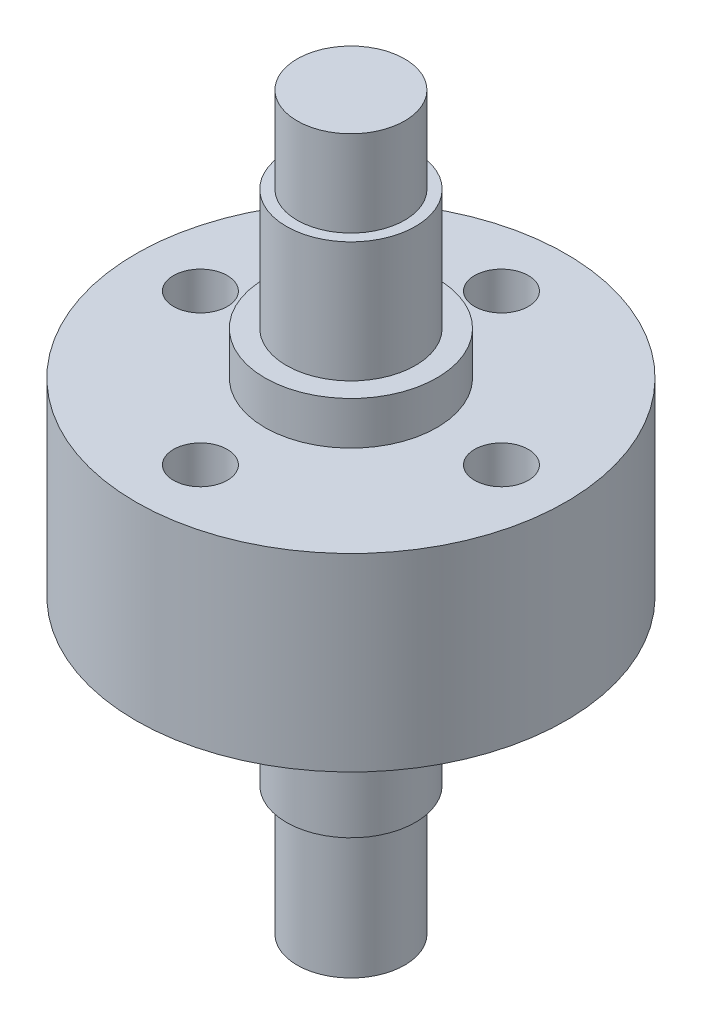
ISO-10303-21;
HEADER;
FILE_DESCRIPTION(('STEP AP214'),'2;1');
FILE_NAME('part.step','',(''),(''),'','','');
FILE_SCHEMA(('AUTOMOTIVE_DESIGN { 1 0 10303 214 1 1 1 1 }'));
ENDSEC;
DATA;
#1=APPLICATION_CONTEXT('core data for automotive mechanical design processes');
#2=APPLICATION_PROTOCOL_DEFINITION('international standard','automotive_design',2000,#1);
#3=PRODUCT_CONTEXT('',#1,'mechanical');
#4=PRODUCT('Part','Part','',(#3));
#5=PRODUCT_RELATED_PRODUCT_CATEGORY('part','',(#4));
#6=PRODUCT_DEFINITION_FORMATION('','',#4);
#7=PRODUCT_DEFINITION_CONTEXT('part definition',#1,'design');
#8=PRODUCT_DEFINITION('design','',#6,#7);
#9=PRODUCT_DEFINITION_SHAPE('','',#8);
#10=(LENGTH_UNIT() NAMED_UNIT(*) SI_UNIT(.MILLI.,.METRE.));
#11=(NAMED_UNIT(*) PLANE_ANGLE_UNIT() SI_UNIT($,.RADIAN.));
#12=(NAMED_UNIT(*) SI_UNIT($,.STERADIAN.) SOLID_ANGLE_UNIT());
#13=UNCERTAINTY_MEASURE_WITH_UNIT(LENGTH_MEASURE(1.E-05),#10,'distance_accuracy_value','');
#14=(GEOMETRIC_REPRESENTATION_CONTEXT(3) GLOBAL_UNCERTAINTY_ASSIGNED_CONTEXT((#13)) GLOBAL_UNIT_ASSIGNED_CONTEXT((#10,
#11,#12)) REPRESENTATION_CONTEXT('',''));
#15=CARTESIAN_POINT('',(0.,0.,0.));
#16=DIRECTION('',(0.,0.,1.));
#17=DIRECTION('',(1.,0.,0.));
#18=AXIS2_PLACEMENT_3D('',#15,#16,#17);
#19=CARTESIAN_POINT('',(2.21364849368684,7.97796080297677,0.));
#20=DIRECTION('',(0.,1.,0.));
#21=DIRECTION('',(0.,0.,1.));
#22=AXIS2_PLACEMENT_3D('',#19,#20,#21);
#23=PLANE('',#22);
#24=CARTESIAN_POINT('',(-8.78635150621402,7.97796080297677,0.));
#25=DIRECTION('',(0.,-1.,0.));
#26=DIRECTION('',(0.,0.,-1.));
#27=AXIS2_PLACEMENT_3D('',#24,#25,#26);
#28=CIRCLE('',#27,1.25);
#29=CARTESIAN_POINT('',(-8.78635150621402,7.97796080297677,-1.24999999999993));
#30=VERTEX_POINT('',#29);
#31=EDGE_CURVE('E101',#30,#30,#28,.T.);
#32=ORIENTED_EDGE('',*,*,#31,.F.);
#33=EDGE_LOOP('',(#32));
#34=FACE_BOUND('',#33,.T.);
#35=CARTESIAN_POINT('',(-1.78635150621402,7.97796080297677,-7.));
#36=DIRECTION('',(0.,-1.,0.));
#37=DIRECTION('',(0.,0.,-1.));
#38=AXIS2_PLACEMENT_3D('',#35,#36,#37);
#39=CIRCLE('',#38,1.25);
#40=CARTESIAN_POINT('',(-1.78635150621402,7.97796080297677,-8.25));
#41=VERTEX_POINT('',#40);
#42=EDGE_CURVE('E95',#41,#41,#39,.T.);
#43=ORIENTED_EDGE('',*,*,#42,.F.);
#44=EDGE_LOOP('',(#43));
#45=FACE_BOUND('',#44,.T.);
#46=CARTESIAN_POINT('',(5.21364849378598,7.97796080297677,0.));
#47=DIRECTION('',(0.,-1.,0.));
#48=DIRECTION('',(0.,0.,-1.));
#49=AXIS2_PLACEMENT_3D('',#46,#47,#48);
#50=CIRCLE('',#49,1.25);
#51=CARTESIAN_POINT('',(5.21364849378598,7.97796080297677,-1.25000000000002));
#52=VERTEX_POINT('',#51);
#53=EDGE_CURVE('E92',#52,#52,#50,.T.);
#54=ORIENTED_EDGE('',*,*,#53,.F.);
#55=EDGE_LOOP('',(#54));
#56=FACE_BOUND('',#55,.T.);
#57=CARTESIAN_POINT('',(-1.78635150621402,7.97796080297677,7.));
#58=DIRECTION('',(0.,-1.,0.));
#59=DIRECTION('',(0.,0.,-1.));
#60=AXIS2_PLACEMENT_3D('',#57,#58,#59);
#61=CIRCLE('',#60,1.25);
#62=CARTESIAN_POINT('',(-1.78635150621402,7.97796080297677,5.75));
#63=VERTEX_POINT('',#62);
#64=EDGE_CURVE('E86',#63,#63,#61,.T.);
#65=ORIENTED_EDGE('',*,*,#64,.F.);
#66=EDGE_LOOP('',(#65));
#67=FACE_BOUND('',#66,.T.);
#68=CARTESIAN_POINT('',(-1.78635150621402,7.97796080297677,0.));
#69=DIRECTION('',(0.,1.,0.));
#70=DIRECTION('',(0.,0.,1.));
#71=AXIS2_PLACEMENT_3D('',#68,#69,#70);
#72=CIRCLE('',#71,10.0000000000246);
#73=CARTESIAN_POINT('',(-1.78635150621402,7.97796080297677,10.0000000000246));
#74=VERTEX_POINT('',#73);
#75=EDGE_CURVE('E10',#74,#74,#72,.T.);
#76=ORIENTED_EDGE('',*,*,#75,.F.);
#77=EDGE_LOOP('',(#76));
#78=FACE_BOUND('',#77,.T.);
#79=CARTESIAN_POINT('',(-1.78635150621402,7.97796080297677,0.));
#80=DIRECTION('',(0.,1.,0.));
#81=DIRECTION('',(0.,0.,1.));
#82=AXIS2_PLACEMENT_3D('',#79,#80,#81);
#83=CIRCLE('',#82,3.99999999990087);
#84=CARTESIAN_POINT('',(-1.78635150621402,7.97796080297677,3.99999999990087));
#85=VERTEX_POINT('',#84);
#86=EDGE_CURVE('E80',#85,#85,#83,.T.);
#87=ORIENTED_EDGE('',*,*,#86,.T.);
#88=EDGE_LOOP('',(#87));
#89=FACE_BOUND('',#88,.T.);
#90=ADVANCED_FACE('F34',(#34,#45,#56,#67,#78,#89),#23,.F.);
#91=CARTESIAN_POINT('',(-1.78635150621402,28.3779608029715,0.));
#92=DIRECTION('',(0.,1.,0.));
#93=DIRECTION('',(0.,0.,1.));
#94=AXIS2_PLACEMENT_3D('',#91,#92,#93);
#95=CYLINDRICAL_SURFACE('',#94,10.0000000000246);
#96=CARTESIAN_POINT('',(-1.78635150621402,16.7779608029166,0.));
#97=DIRECTION('',(0.,1.,0.));
#98=DIRECTION('',(0.,0.,1.));
#99=AXIS2_PLACEMENT_3D('',#96,#97,#98);
#100=CIRCLE('',#99,10.0000000000246);
#101=CARTESIAN_POINT('',(-1.78635150621402,16.7779608029166,10.0000000000246));
#102=VERTEX_POINT('',#101);
#103=EDGE_CURVE('E41',#102,#102,#100,.T.);
#104=ORIENTED_EDGE('',*,*,#103,.F.);
#105=EDGE_LOOP('',(#104));
#106=FACE_BOUND('',#105,.T.);
#107=ORIENTED_EDGE('',*,*,#75,.T.);
#108=EDGE_LOOP('',(#107));
#109=FACE_BOUND('',#108,.T.);
#110=ADVANCED_FACE('F110',(#106,#109),#95,.T.);
#111=CARTESIAN_POINT('',(2.2136484937978,16.7779608029166,0.));
#112=DIRECTION('',(0.,-1.,0.));
#113=DIRECTION('',(0.,0.,-1.));
#114=AXIS2_PLACEMENT_3D('',#111,#112,#113);
#115=PLANE('',#114);
#116=CARTESIAN_POINT('',(-8.78635150621402,16.7779608029166,0.));
#117=DIRECTION('',(0.,-1.,0.));
#118=DIRECTION('',(0.,0.,-1.));
#119=AXIS2_PLACEMENT_3D('',#116,#117,#118);
#120=CIRCLE('',#119,1.25);
#121=CARTESIAN_POINT('',(-8.78635150621402,16.7779608029166,-1.24999999999992));
#122=VERTEX_POINT('',#121);
#123=EDGE_CURVE('E98',#122,#122,#120,.T.);
#124=ORIENTED_EDGE('',*,*,#123,.T.);
#125=EDGE_LOOP('',(#124));
#126=FACE_BOUND('',#125,.T.);
#127=CARTESIAN_POINT('',(-1.78635150621402,16.7779608029166,-7.));
#128=DIRECTION('',(0.,-1.,0.));
#129=DIRECTION('',(0.,0.,-1.));
#130=AXIS2_PLACEMENT_3D('',#127,#128,#129);
#131=CIRCLE('',#130,1.25);
#132=CARTESIAN_POINT('',(-1.78635150621402,16.7779608029166,-8.25));
#133=VERTEX_POINT('',#132);
#134=EDGE_CURVE('E37',#133,#133,#131,.T.);
#135=ORIENTED_EDGE('',*,*,#134,.T.);
#136=EDGE_LOOP('',(#135));
#137=FACE_BOUND('',#136,.T.);
#138=CARTESIAN_POINT('',(5.21364849378598,16.7779608029166,0.));
#139=DIRECTION('',(0.,-1.,0.));
#140=DIRECTION('',(0.,0.,-1.));
#141=AXIS2_PLACEMENT_3D('',#138,#139,#140);
#142=CIRCLE('',#141,1.25);
#143=CARTESIAN_POINT('',(5.21364849378598,16.7779608029166,-1.25000000000002));
#144=VERTEX_POINT('',#143);
#145=EDGE_CURVE('E89',#144,#144,#142,.T.);
#146=ORIENTED_EDGE('',*,*,#145,.T.);
#147=EDGE_LOOP('',(#146));
#148=FACE_BOUND('',#147,.T.);
#149=CARTESIAN_POINT('',(-1.78635150621402,16.7779608029166,7.));
#150=DIRECTION('',(0.,-1.,0.));
#151=DIRECTION('',(0.,0.,-1.));
#152=AXIS2_PLACEMENT_3D('',#149,#150,#151);
#153=CIRCLE('',#152,1.25);
#154=CARTESIAN_POINT('',(-1.78635150621402,16.7779608029166,5.75));
#155=VERTEX_POINT('',#154);
#156=EDGE_CURVE('E83',#155,#155,#153,.T.);
#157=ORIENTED_EDGE('',*,*,#156,.T.);
#158=EDGE_LOOP('',(#157));
#159=FACE_BOUND('',#158,.T.);
#160=CARTESIAN_POINT('',(-1.78635150621402,16.7779608029166,0.));
#161=DIRECTION('',(0.,1.,0.));
#162=DIRECTION('',(0.,0.,1.));
#163=AXIS2_PLACEMENT_3D('',#160,#161,#162);
#164=CIRCLE('',#163,4.00000000001183);
#165=CARTESIAN_POINT('',(-1.78635150621402,16.7779608029166,4.00000000001183));
#166=VERTEX_POINT('',#165);
#167=EDGE_CURVE('E45',#166,#166,#164,.T.);
#168=ORIENTED_EDGE('',*,*,#167,.F.);
#169=EDGE_LOOP('',(#168));
#170=FACE_BOUND('',#169,.T.);
#171=ORIENTED_EDGE('',*,*,#103,.T.);
#172=EDGE_LOOP('',(#171));
#173=FACE_BOUND('',#172,.T.);
#174=ADVANCED_FACE('F180',(#126,#137,#148,#159,#170,#173),#115,.F.);
#175=CARTESIAN_POINT('',(-1.78635150621402,28.3779608029715,0.));
#176=DIRECTION('',(0.,1.,0.));
#177=DIRECTION('',(0.,0.,1.));
#178=AXIS2_PLACEMENT_3D('',#175,#176,#177);
#179=CYLINDRICAL_SURFACE('',#178,4.00000000001183);
#180=CARTESIAN_POINT('',(-1.78635150621402,18.7779608029107,0.));
#181=DIRECTION('',(0.,1.,0.));
#182=DIRECTION('',(0.,0.,1.));
#183=AXIS2_PLACEMENT_3D('',#180,#181,#182);
#184=CIRCLE('',#183,4.00000000001183);
#185=CARTESIAN_POINT('',(-1.78635150621402,18.7779608029107,4.00000000001183));
#186=VERTEX_POINT('',#185);
#187=EDGE_CURVE('E50',#186,#186,#184,.T.);
#188=ORIENTED_EDGE('',*,*,#187,.F.);
#189=EDGE_LOOP('',(#188));
#190=FACE_BOUND('',#189,.T.);
#191=ORIENTED_EDGE('',*,*,#167,.T.);
#192=EDGE_LOOP('',(#191));
#193=FACE_BOUND('',#192,.T.);
#194=ADVANCED_FACE('F176',(#190,#193),#179,.T.);
#195=CARTESIAN_POINT('',(1.21364849379598,18.7779608029107,0.));
#196=DIRECTION('',(0.,-1.,0.));
#197=DIRECTION('',(0.,0.,-1.));
#198=AXIS2_PLACEMENT_3D('',#195,#196,#197);
#199=PLANE('',#198);
#200=CARTESIAN_POINT('',(-1.78635150621402,18.7779608029107,0.));
#201=DIRECTION('',(0.,1.,0.));
#202=DIRECTION('',(0.,0.,1.));
#203=AXIS2_PLACEMENT_3D('',#200,#201,#202);
#204=CIRCLE('',#203,3.00000000001001);
#205=CARTESIAN_POINT('',(-1.78635150621402,18.7779608029107,3.00000000001001));
#206=VERTEX_POINT('',#205);
#207=EDGE_CURVE('E53',#206,#206,#204,.T.);
#208=ORIENTED_EDGE('',*,*,#207,.F.);
#209=EDGE_LOOP('',(#208));
#210=FACE_BOUND('',#209,.T.);
#211=ORIENTED_EDGE('',*,*,#187,.T.);
#212=EDGE_LOOP('',(#211));
#213=FACE_BOUND('',#212,.T.);
#214=ADVANCED_FACE('F172',(#210,#213),#199,.F.);
#215=CARTESIAN_POINT('',(-1.78635150621402,28.3779608029715,0.));
#216=DIRECTION('',(0.,1.,0.));
#217=DIRECTION('',(0.,0.,1.));
#218=AXIS2_PLACEMENT_3D('',#215,#216,#217);
#219=CYLINDRICAL_SURFACE('',#218,3.00000000001001);
#220=CARTESIAN_POINT('',(-1.78635150621402,24.3779608029706,0.));
#221=DIRECTION('',(0.,1.,0.));
#222=DIRECTION('',(0.,0.,1.));
#223=AXIS2_PLACEMENT_3D('',#220,#221,#222);
#224=CIRCLE('',#223,3.00000000001001);
#225=CARTESIAN_POINT('',(-1.78635150621402,24.3779608029706,3.00000000001001));
#226=VERTEX_POINT('',#225);
#227=EDGE_CURVE('E56',#226,#226,#224,.T.);
#228=ORIENTED_EDGE('',*,*,#227,.F.);
#229=EDGE_LOOP('',(#228));
#230=FACE_BOUND('',#229,.T.);
#231=ORIENTED_EDGE('',*,*,#207,.T.);
#232=EDGE_LOOP('',(#231));
#233=FACE_BOUND('',#232,.T.);
#234=ADVANCED_FACE('F168',(#230,#233),#219,.T.);
#235=CARTESIAN_POINT('',(0.713648493788707,24.3779608029706,0.));
#236=DIRECTION('',(0.,-1.,0.));
#237=DIRECTION('',(0.,0.,-1.));
#238=AXIS2_PLACEMENT_3D('',#235,#236,#237);
#239=PLANE('',#238);
#240=CARTESIAN_POINT('',(-1.78635150621402,24.3779608029706,0.));
#241=DIRECTION('',(0.,1.,0.));
#242=DIRECTION('',(0.,0.,1.));
#243=AXIS2_PLACEMENT_3D('',#240,#241,#242);
#244=CIRCLE('',#243,2.50000000000273);
#245=CARTESIAN_POINT('',(-1.78635150621402,24.3779608029706,2.50000000000273));
#246=VERTEX_POINT('',#245);
#247=EDGE_CURVE('E59',#246,#246,#244,.T.);
#248=ORIENTED_EDGE('',*,*,#247,.F.);
#249=EDGE_LOOP('',(#248));
#250=FACE_BOUND('',#249,.T.);
#251=ORIENTED_EDGE('',*,*,#227,.T.);
#252=EDGE_LOOP('',(#251));
#253=FACE_BOUND('',#252,.T.);
#254=ADVANCED_FACE('F164',(#250,#253),#239,.F.);
#255=CARTESIAN_POINT('',(-1.78635150621402,28.3779608029715,0.));
#256=DIRECTION('',(0.,1.,0.));
#257=DIRECTION('',(0.,0.,1.));
#258=AXIS2_PLACEMENT_3D('',#255,#256,#257);
#259=CYLINDRICAL_SURFACE('',#258,2.50000000000273);
#260=CARTESIAN_POINT('',(-1.78635150621402,28.3779608029715,0.));
#261=DIRECTION('',(0.,1.,0.));
#262=DIRECTION('',(0.,0.,1.));
#263=AXIS2_PLACEMENT_3D('',#260,#261,#262);
#264=CIRCLE('',#263,2.50000000000273);
#265=CARTESIAN_POINT('',(-1.78635150621402,28.3779608029715,2.50000000000273));
#266=VERTEX_POINT('',#265);
#267=EDGE_CURVE('E62',#266,#266,#264,.T.);
#268=ORIENTED_EDGE('',*,*,#267,.F.);
#269=EDGE_LOOP('',(#268));
#270=FACE_BOUND('',#269,.T.);
#271=ORIENTED_EDGE('',*,*,#247,.T.);
#272=EDGE_LOOP('',(#271));
#273=FACE_BOUND('',#272,.T.);
#274=ADVANCED_FACE('F158',(#270,#273),#259,.T.);
#275=CARTESIAN_POINT('',(-1.78635150621402,28.3779608029715,0.));
#276=DIRECTION('',(0.,-1.,0.));
#277=DIRECTION('',(0.,0.,-1.));
#278=AXIS2_PLACEMENT_3D('',#275,#276,#277);
#279=PLANE('',#278);
#280=ORIENTED_EDGE('',*,*,#267,.T.);
#281=EDGE_LOOP('',(#280));
#282=FACE_BOUND('',#281,.T.);
#283=ADVANCED_FACE('F153',(#282),#279,.F.);
#284=CARTESIAN_POINT('',(-1.78635150621402,-5.62203919697574,0.));
#285=DIRECTION('',(0.,1.,0.));
#286=DIRECTION('',(0.,0.,1.));
#287=AXIS2_PLACEMENT_3D('',#284,#285,#286);
#288=PLANE('',#287);
#289=CARTESIAN_POINT('',(-1.78635150621402,-5.62203919697573,0.));
#290=DIRECTION('',(0.,1.,0.));
#291=DIRECTION('',(0.,0.,1.));
#292=AXIS2_PLACEMENT_3D('',#289,#290,#291);
#293=CIRCLE('',#292,2.50000000003183);
#294=CARTESIAN_POINT('',(-1.78635150621402,-5.62203919697573,2.50000000003183));
#295=VERTEX_POINT('',#294);
#296=EDGE_CURVE('E65',#295,#295,#293,.T.);
#297=ORIENTED_EDGE('',*,*,#296,.F.);
#298=EDGE_LOOP('',(#297));
#299=FACE_BOUND('',#298,.T.);
#300=ADVANCED_FACE('F148',(#299),#288,.F.);
#301=CARTESIAN_POINT('',(-1.78635150621402,28.3779608029715,0.));
#302=DIRECTION('',(0.,1.,0.));
#303=DIRECTION('',(0.,0.,1.));
#304=AXIS2_PLACEMENT_3D('',#301,#302,#303);
#305=CYLINDRICAL_SURFACE('',#304,2.50000000003183);
#306=CARTESIAN_POINT('',(-1.78635150621402,0.377960802971141,0.));
#307=DIRECTION('',(0.,1.,0.));
#308=DIRECTION('',(0.,0.,1.));
#309=AXIS2_PLACEMENT_3D('',#306,#307,#308);
#310=CIRCLE('',#309,2.50000000003183);
#311=CARTESIAN_POINT('',(-1.78635150621402,0.377960802971141,2.50000000003183));
#312=VERTEX_POINT('',#311);
#313=EDGE_CURVE('E68',#312,#312,#310,.T.);
#314=ORIENTED_EDGE('',*,*,#313,.F.);
#315=EDGE_LOOP('',(#314));
#316=FACE_BOUND('',#315,.T.);
#317=ORIENTED_EDGE('',*,*,#296,.T.);
#318=EDGE_LOOP('',(#317));
#319=FACE_BOUND('',#318,.T.);
#320=ADVANCED_FACE('F142',(#316,#319),#305,.T.);
#321=CARTESIAN_POINT('',(0.71364849381781,0.377960802971141,0.));
#322=DIRECTION('',(0.,1.,0.));
#323=DIRECTION('',(0.,0.,1.));
#324=AXIS2_PLACEMENT_3D('',#321,#322,#323);
#325=PLANE('',#324);
#326=CARTESIAN_POINT('',(-1.78635150621402,0.377960802971141,0.));
#327=DIRECTION('',(0.,1.,0.));
#328=DIRECTION('',(0.,0.,1.));
#329=AXIS2_PLACEMENT_3D('',#326,#327,#328);
#330=CIRCLE('',#329,3.00000000002456);
#331=CARTESIAN_POINT('',(-1.78635150621402,0.377960802971141,3.00000000002456));
#332=VERTEX_POINT('',#331);
#333=EDGE_CURVE('E71',#332,#332,#330,.T.);
#334=ORIENTED_EDGE('',*,*,#333,.F.);
#335=EDGE_LOOP('',(#334));
#336=FACE_BOUND('',#335,.T.);
#337=ORIENTED_EDGE('',*,*,#313,.T.);
#338=EDGE_LOOP('',(#337));
#339=FACE_BOUND('',#338,.T.);
#340=ADVANCED_FACE('F136',(#336,#339),#325,.F.);
#341=CARTESIAN_POINT('',(-1.78635150621402,28.3779608029715,0.));
#342=DIRECTION('',(0.,1.,0.));
#343=DIRECTION('',(0.,0.,1.));
#344=AXIS2_PLACEMENT_3D('',#341,#342,#343);
#345=CYLINDRICAL_SURFACE('',#344,3.00000000002456);
#346=CARTESIAN_POINT('',(-1.78635150621402,5.97796080298128,0.));
#347=DIRECTION('',(0.,1.,0.));
#348=DIRECTION('',(0.,0.,1.));
#349=AXIS2_PLACEMENT_3D('',#346,#347,#348);
#350=CIRCLE('',#349,3.00000000002456);
#351=CARTESIAN_POINT('',(-1.78635150621402,5.97796080298128,3.00000000002456));
#352=VERTEX_POINT('',#351);
#353=EDGE_CURVE('E74',#352,#352,#350,.T.);
#354=ORIENTED_EDGE('',*,*,#353,.F.);
#355=EDGE_LOOP('',(#354));
#356=FACE_BOUND('',#355,.T.);
#357=ORIENTED_EDGE('',*,*,#333,.T.);
#358=EDGE_LOOP('',(#357));
#359=FACE_BOUND('',#358,.T.);
#360=ADVANCED_FACE('F130',(#356,#359),#345,.T.);
#361=CARTESIAN_POINT('',(1.21364849381053,5.97796080298128,0.));
#362=DIRECTION('',(0.,1.,0.));
#363=DIRECTION('',(0.,0.,1.));
#364=AXIS2_PLACEMENT_3D('',#361,#362,#363);
#365=PLANE('',#364);
#366=CARTESIAN_POINT('',(-1.78635150621402,5.97796080298128,0.));
#367=DIRECTION('',(0.,1.,0.));
#368=DIRECTION('',(0.,0.,1.));
#369=AXIS2_PLACEMENT_3D('',#366,#367,#368);
#370=CIRCLE('',#369,3.99999999990087);
#371=CARTESIAN_POINT('',(-1.78635150621402,5.97796080298128,3.99999999990087));
#372=VERTEX_POINT('',#371);
#373=EDGE_CURVE('E77',#372,#372,#370,.T.);
#374=ORIENTED_EDGE('',*,*,#373,.F.);
#375=EDGE_LOOP('',(#374));
#376=FACE_BOUND('',#375,.T.);
#377=ORIENTED_EDGE('',*,*,#353,.T.);
#378=EDGE_LOOP('',(#377));
#379=FACE_BOUND('',#378,.T.);
#380=ADVANCED_FACE('F124',(#376,#379),#365,.F.);
#381=CARTESIAN_POINT('',(-1.78635150621402,28.3779608029715,0.));
#382=DIRECTION('',(0.,1.,0.));
#383=DIRECTION('',(0.,0.,1.));
#384=AXIS2_PLACEMENT_3D('',#381,#382,#383);
#385=CYLINDRICAL_SURFACE('',#384,3.99999999990087);
#386=ORIENTED_EDGE('',*,*,#86,.F.);
#387=EDGE_LOOP('',(#386));
#388=FACE_BOUND('',#387,.T.);
#389=ORIENTED_EDGE('',*,*,#373,.T.);
#390=EDGE_LOOP('',(#389));
#391=FACE_BOUND('',#390,.T.);
#392=ADVANCED_FACE('F120',(#388,#391),#385,.T.);
#393=CARTESIAN_POINT('',(-1.78635150621402,7.97796080297677,7.));
#394=DIRECTION('',(0.,-1.,0.));
#395=DIRECTION('',(0.,0.,-1.));
#396=AXIS2_PLACEMENT_3D('',#393,#394,#395);
#397=CYLINDRICAL_SURFACE('',#396,1.25);
#398=ORIENTED_EDGE('',*,*,#64,.T.);
#399=EDGE_LOOP('',(#398));
#400=FACE_BOUND('',#399,.T.);
#401=ORIENTED_EDGE('',*,*,#156,.F.);
#402=EDGE_LOOP('',(#401));
#403=FACE_BOUND('',#402,.T.);
#404=ADVANCED_FACE('F123',(#400,#403),#397,.F.);
#405=CARTESIAN_POINT('',(5.21364849378598,7.97796080297677,0.));
#406=DIRECTION('',(0.,-1.,0.));
#407=DIRECTION('',(0.,0.,-1.));
#408=AXIS2_PLACEMENT_3D('',#405,#406,#407);
#409=CYLINDRICAL_SURFACE('',#408,1.25);
#410=ORIENTED_EDGE('',*,*,#53,.T.);
#411=EDGE_LOOP('',(#410));
#412=FACE_BOUND('',#411,.T.);
#413=ORIENTED_EDGE('',*,*,#145,.F.);
#414=EDGE_LOOP('',(#413));
#415=FACE_BOUND('',#414,.T.);
#416=ADVANCED_FACE('F264',(#412,#415),#409,.F.);
#417=CARTESIAN_POINT('',(-1.78635150621402,7.97796080297677,-7.));
#418=DIRECTION('',(0.,-1.,0.));
#419=DIRECTION('',(0.,0.,-1.));
#420=AXIS2_PLACEMENT_3D('',#417,#418,#419);
#421=CYLINDRICAL_SURFACE('',#420,1.25);
#422=ORIENTED_EDGE('',*,*,#42,.T.);
#423=EDGE_LOOP('',(#422));
#424=FACE_BOUND('',#423,.T.);
#425=ORIENTED_EDGE('',*,*,#134,.F.);
#426=EDGE_LOOP('',(#425));
#427=FACE_BOUND('',#426,.T.);
#428=ADVANCED_FACE('F296',(#424,#427),#421,.F.);
#429=CARTESIAN_POINT('',(-8.78635150621402,7.97796080297677,0.));
#430=DIRECTION('',(0.,-1.,0.));
#431=DIRECTION('',(0.,0.,-1.));
#432=AXIS2_PLACEMENT_3D('',#429,#430,#431);
#433=CYLINDRICAL_SURFACE('',#432,1.25);
#434=ORIENTED_EDGE('',*,*,#31,.T.);
#435=EDGE_LOOP('',(#434));
#436=FACE_BOUND('',#435,.T.);
#437=ORIENTED_EDGE('',*,*,#123,.F.);
#438=EDGE_LOOP('',(#437));
#439=FACE_BOUND('',#438,.T.);
#440=ADVANCED_FACE('F105',(#436,#439),#433,.F.);
#441=CLOSED_SHELL('',(#90,#110,#174,#194,#214,#234,#254,#274,#283,#300,#320,#340,#360,#380,#392,
#404,#416,#428,#440));
#442=MANIFOLD_SOLID_BREP('B2',#441);
#443=ADVANCED_BREP_SHAPE_REPRESENTATION('',(#18,#442),#14);
#444=SHAPE_DEFINITION_REPRESENTATION(#9,#443);
ENDSEC;
END-ISO-10303-21;
